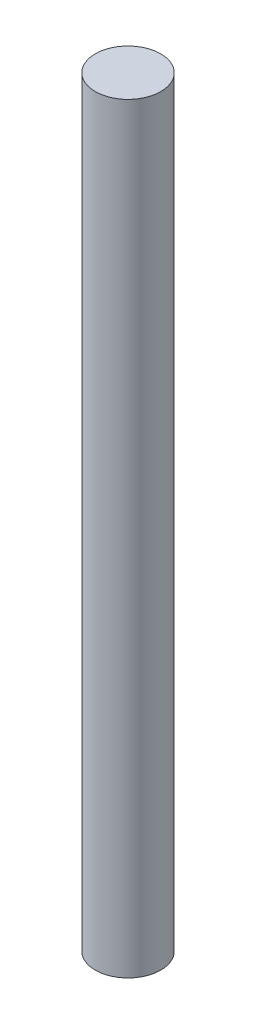
ISO-10303-21;
HEADER;
FILE_DESCRIPTION(('STEP AP214'),'2;1');
FILE_NAME('part.step','',(''),(''),'','','');
FILE_SCHEMA(('AUTOMOTIVE_DESIGN { 1 0 10303 214 1 1 1 1 }'));
ENDSEC;
DATA;
#1=APPLICATION_CONTEXT('core data for automotive mechanical design processes');
#2=APPLICATION_PROTOCOL_DEFINITION('international standard','automotive_design',2000,#1);
#3=PRODUCT_CONTEXT('',#1,'mechanical');
#4=PRODUCT('Part','Part','',(#3));
#5=PRODUCT_RELATED_PRODUCT_CATEGORY('part','',(#4));
#6=PRODUCT_DEFINITION_FORMATION('','',#4);
#7=PRODUCT_DEFINITION_CONTEXT('part definition',#1,'design');
#8=PRODUCT_DEFINITION('design','',#6,#7);
#9=PRODUCT_DEFINITION_SHAPE('','',#8);
#10=(LENGTH_UNIT() NAMED_UNIT(*) SI_UNIT(.MILLI.,.METRE.));
#11=(NAMED_UNIT(*) PLANE_ANGLE_UNIT() SI_UNIT($,.RADIAN.));
#12=(NAMED_UNIT(*) SI_UNIT($,.STERADIAN.) SOLID_ANGLE_UNIT());
#13=UNCERTAINTY_MEASURE_WITH_UNIT(LENGTH_MEASURE(1.E-05),#10,'distance_accuracy_value','');
#14=(GEOMETRIC_REPRESENTATION_CONTEXT(3) GLOBAL_UNCERTAINTY_ASSIGNED_CONTEXT((#13)) GLOBAL_UNIT_ASSIGNED_CONTEXT((#10,
#11,#12)) REPRESENTATION_CONTEXT('',''));
#15=CARTESIAN_POINT('',(0.,0.,0.));
#16=DIRECTION('',(0.,0.,1.));
#17=DIRECTION('',(1.,0.,0.));
#18=AXIS2_PLACEMENT_3D('',#15,#16,#17);
#19=CARTESIAN_POINT('',(0.,76.2,0.));
#20=DIRECTION('',(0.,-1.,0.));
#21=DIRECTION('',(0.,0.,-1.));
#22=AXIS2_PLACEMENT_3D('',#19,#20,#21);
#23=CYLINDRICAL_SURFACE('',#22,3.2766);
#24=CARTESIAN_POINT('',(0.,76.2,0.));
#25=DIRECTION('',(0.,1.,0.));
#26=DIRECTION('',(0.,0.,1.));
#27=AXIS2_PLACEMENT_3D('',#24,#25,#26);
#28=CIRCLE('',#27,3.2766);
#29=CARTESIAN_POINT('',(0.,76.2,-3.2766));
#30=VERTEX_POINT('',#29);
#31=EDGE_CURVE('E10',#30,#30,#28,.T.);
#32=CARTESIAN_POINT('',(0.,0.,0.));
#33=DIRECTION('',(0.,1.,0.));
#34=DIRECTION('',(0.,0.,1.));
#35=AXIS2_PLACEMENT_3D('',#32,#33,#34);
#36=CIRCLE('',#35,3.2766);
#37=CARTESIAN_POINT('',(0.,0.,-3.2766));
#38=VERTEX_POINT('',#37);
#39=EDGE_CURVE('E44',#38,#38,#36,.T.);
#40=CARTESIAN_POINT('',(0.,76.2,-3.2766));
#41=CARTESIAN_POINT('',(0.,75.40625,-3.2766));
#42=CARTESIAN_POINT('',(0.,74.6125,-3.2766));
#43=CARTESIAN_POINT('',(0.,73.025,-3.2766));
#44=CARTESIAN_POINT('',(0.,72.23125,-3.2766));
#45=CARTESIAN_POINT('',(0.,70.64375,-3.2766));
#46=CARTESIAN_POINT('',(0.,69.85,-3.2766));
#47=CARTESIAN_POINT('',(0.,68.2625,-3.2766));
#48=CARTESIAN_POINT('',(0.,67.46875,-3.2766));
#49=CARTESIAN_POINT('',(0.,65.88125,-3.2766));
#50=CARTESIAN_POINT('',(0.,65.0875,-3.2766));
#51=CARTESIAN_POINT('',(0.,63.5,-3.2766));
#52=CARTESIAN_POINT('',(0.,62.70625,-3.2766));
#53=CARTESIAN_POINT('',(0.,61.11875,-3.2766));
#54=CARTESIAN_POINT('',(0.,60.325,-3.2766));
#55=CARTESIAN_POINT('',(0.,58.7375,-3.2766));
#56=CARTESIAN_POINT('',(0.,57.94375,-3.2766));
#57=CARTESIAN_POINT('',(0.,56.35625,-3.2766));
#58=CARTESIAN_POINT('',(0.,55.5625,-3.2766));
#59=CARTESIAN_POINT('',(0.,53.975,-3.2766));
#60=CARTESIAN_POINT('',(0.,53.18125,-3.2766));
#61=CARTESIAN_POINT('',(0.,51.59375,-3.2766));
#62=CARTESIAN_POINT('',(0.,50.8,-3.2766));
#63=CARTESIAN_POINT('',(0.,49.2125,-3.2766));
#64=CARTESIAN_POINT('',(0.,48.41875,-3.2766));
#65=CARTESIAN_POINT('',(0.,46.83125,-3.2766));
#66=CARTESIAN_POINT('',(0.,46.0375,-3.2766));
#67=CARTESIAN_POINT('',(0.,44.45,-3.2766));
#68=CARTESIAN_POINT('',(0.,43.65625,-3.2766));
#69=CARTESIAN_POINT('',(0.,42.06875,-3.2766));
#70=CARTESIAN_POINT('',(0.,41.275,-3.2766));
#71=CARTESIAN_POINT('',(0.,39.6875,-3.2766));
#72=CARTESIAN_POINT('',(0.,38.89375,-3.2766));
#73=CARTESIAN_POINT('',(0.,37.30625,-3.2766));
#74=CARTESIAN_POINT('',(0.,36.5125,-3.2766));
#75=CARTESIAN_POINT('',(0.,34.925,-3.2766));
#76=CARTESIAN_POINT('',(0.,34.13125,-3.2766));
#77=CARTESIAN_POINT('',(0.,32.54375,-3.2766));
#78=CARTESIAN_POINT('',(0.,31.75,-3.2766));
#79=CARTESIAN_POINT('',(0.,30.1625,-3.2766));
#80=CARTESIAN_POINT('',(0.,29.36875,-3.2766));
#81=CARTESIAN_POINT('',(0.,27.78125,-3.2766));
#82=CARTESIAN_POINT('',(0.,26.9875,-3.2766));
#83=CARTESIAN_POINT('',(0.,25.4,-3.2766));
#84=CARTESIAN_POINT('',(0.,24.60625,-3.2766));
#85=CARTESIAN_POINT('',(0.,23.01875,-3.2766));
#86=CARTESIAN_POINT('',(0.,22.225,-3.2766));
#87=CARTESIAN_POINT('',(0.,20.6375,-3.2766));
#88=CARTESIAN_POINT('',(0.,19.84375,-3.2766));
#89=CARTESIAN_POINT('',(0.,18.25625,-3.2766));
#90=CARTESIAN_POINT('',(0.,17.4625,-3.2766));
#91=CARTESIAN_POINT('',(0.,15.875,-3.2766));
#92=CARTESIAN_POINT('',(0.,15.08125,-3.2766));
#93=CARTESIAN_POINT('',(0.,13.49375,-3.2766));
#94=CARTESIAN_POINT('',(0.,12.7,-3.2766));
#95=CARTESIAN_POINT('',(0.,11.1125,-3.2766));
#96=CARTESIAN_POINT('',(0.,10.31875,-3.2766));
#97=CARTESIAN_POINT('',(0.,8.73125,-3.2766));
#98=CARTESIAN_POINT('',(0.,7.93750000000001,-3.2766));
#99=CARTESIAN_POINT('',(0.,6.35,-3.2766));
#100=CARTESIAN_POINT('',(0.,5.55625,-3.2766));
#101=CARTESIAN_POINT('',(0.,3.96875,-3.2766));
#102=CARTESIAN_POINT('',(0.,3.175,-3.2766));
#103=CARTESIAN_POINT('',(0.,1.5875,-3.2766));
#104=CARTESIAN_POINT('',(0.,0.793750000000001,-3.2766));
#105=CARTESIAN_POINT('',(0.,0.,-3.2766));
#106=B_SPLINE_CURVE_WITH_KNOTS('',3,(#40,#41,#42,#43,#44,#45,#46,#47,#48,#49,#50,#51,#52,#53,
#54,#55,#56,#57,#58,#59,#60,#61,#62,#63,#64,#65,#66,#67,#68,#69,#70,#71,#72,#73,#74,#75,#76,#77,
#78,#79,#80,#81,#82,#83,#84,#85,#86,#87,#88,#89,#90,#91,#92,#93,#94,#95,#96,#97,#98,#99,#100,
#101,#102,#103,#104,#105),.UNSPECIFIED.,.F.,.F.,(4,2,2,2,2,2,2,2,2,2,2,2,2,2,2,2,2,2,2,2,2,2,2,
2,2,2,2,2,2,2,2,2,4),(0.,2.38125,4.7625,7.14375,9.52500000000001,11.90625,14.2875,16.66875,
19.05,21.43125,23.8125,26.19375,28.575,30.95625,33.3375,35.71875,38.1,40.48125,42.8625,45.24375,
47.625,50.00625,52.3875,54.76875,57.15,59.53125,61.9125,64.29375,66.675,69.05625,71.4375,
73.81875,76.2),.UNSPECIFIED.);
#107=EDGE_CURVE('BSEAM41',#30,#38,#106,.T.);
#108=ORIENTED_EDGE('',*,*,#31,.F.);
#109=ORIENTED_EDGE('',*,*,#39,.T.);
#110=ORIENTED_EDGE('',*,*,#107,.T.);
#111=ORIENTED_EDGE('',*,*,#107,.F.);
#112=EDGE_LOOP('',(#108,#110,#109,#111));
#113=FACE_BOUND('',#112,.T.);
#114=ADVANCED_FACE('F41',(#113),#23,.T.);
#115=CARTESIAN_POINT('',(0.,76.2,0.));
#116=DIRECTION('',(0.,1.,0.));
#117=DIRECTION('',(0.,0.,1.));
#118=AXIS2_PLACEMENT_3D('',#115,#116,#117);
#119=PLANE('',#118);
#120=ORIENTED_EDGE('',*,*,#31,.T.);
#121=EDGE_LOOP('',(#120));
#122=FACE_BOUND('',#121,.T.);
#123=ADVANCED_FACE('F58',(#122),#119,.T.);
#124=CARTESIAN_POINT('',(0.,0.,0.));
#125=DIRECTION('',(0.,1.,0.));
#126=DIRECTION('',(0.,0.,1.));
#127=AXIS2_PLACEMENT_3D('',#124,#125,#126);
#128=PLANE('',#127);
#129=ORIENTED_EDGE('',*,*,#39,.F.);
#130=EDGE_LOOP('',(#129));
#131=FACE_BOUND('',#130,.T.);
#132=ADVANCED_FACE('F56',(#131),#128,.F.);
#133=CLOSED_SHELL('',(#114,#123,#132));
#134=MANIFOLD_SOLID_BREP('B2',#133);
#135=ADVANCED_BREP_SHAPE_REPRESENTATION('',(#18,#134),#14);
#136=SHAPE_DEFINITION_REPRESENTATION(#9,#135);
ENDSEC;
END-ISO-10303-21;
